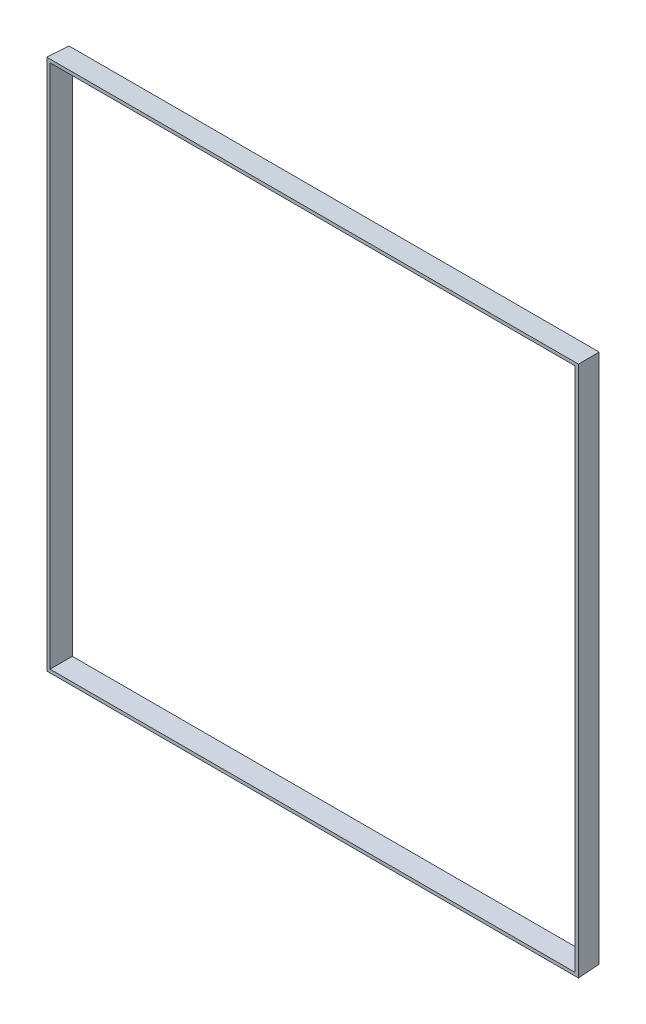
ISO-10303-21;
HEADER;
FILE_DESCRIPTION(('STEP AP214'),'2;1');
FILE_NAME('part.step','',(''),(''),'','','');
FILE_SCHEMA(('AUTOMOTIVE_DESIGN { 1 0 10303 214 1 1 1 1 }'));
ENDSEC;
DATA;
#1=APPLICATION_CONTEXT('core data for automotive mechanical design processes');
#2=APPLICATION_PROTOCOL_DEFINITION('international standard','automotive_design',2000,#1);
#3=PRODUCT_CONTEXT('',#1,'mechanical');
#4=PRODUCT('Part','Part','',(#3));
#5=PRODUCT_RELATED_PRODUCT_CATEGORY('part','',(#4));
#6=PRODUCT_DEFINITION_FORMATION('','',#4);
#7=PRODUCT_DEFINITION_CONTEXT('part definition',#1,'design');
#8=PRODUCT_DEFINITION('design','',#6,#7);
#9=PRODUCT_DEFINITION_SHAPE('','',#8);
#10=(LENGTH_UNIT() NAMED_UNIT(*) SI_UNIT(.MILLI.,.METRE.));
#11=(NAMED_UNIT(*) PLANE_ANGLE_UNIT() SI_UNIT($,.RADIAN.));
#12=(NAMED_UNIT(*) SI_UNIT($,.STERADIAN.) SOLID_ANGLE_UNIT());
#13=UNCERTAINTY_MEASURE_WITH_UNIT(LENGTH_MEASURE(1.E-05),#10,'distance_accuracy_value','');
#14=(GEOMETRIC_REPRESENTATION_CONTEXT(3) GLOBAL_UNCERTAINTY_ASSIGNED_CONTEXT((#13)) GLOBAL_UNIT_ASSIGNED_CONTEXT((#10,
#11,#12)) REPRESENTATION_CONTEXT('',''));
#15=CARTESIAN_POINT('',(0.,0.,0.));
#16=DIRECTION('',(0.,0.,1.));
#17=DIRECTION('',(1.,0.,0.));
#18=AXIS2_PLACEMENT_3D('',#15,#16,#17);
#19=CARTESIAN_POINT('',(0.,0.,0.));
#20=DIRECTION('',(0.,0.,-1.));
#21=DIRECTION('',(-1.,0.,0.));
#22=AXIS2_PLACEMENT_3D('',#19,#20,#21);
#23=PLANE('',#22);
#24=DIRECTION('',(0.,1.,0.));
#25=VECTOR('',#24,1.);
#26=CARTESIAN_POINT('',(123.3,-123.3,0.));
#27=LINE('',#26,#25);
#28=CARTESIAN_POINT('',(123.3,-123.3,0.));
#29=VERTEX_POINT('',#28);
#30=CARTESIAN_POINT('',(123.3,123.3,0.));
#31=VERTEX_POINT('',#30);
#32=EDGE_CURVE('E123',#29,#31,#27,.T.);
#33=ORIENTED_EDGE('',*,*,#32,.T.);
#34=DIRECTION('',(-1.,0.,0.));
#35=VECTOR('',#34,1.);
#36=CARTESIAN_POINT('',(-123.3,123.3,0.));
#37=LINE('',#36,#35);
#38=CARTESIAN_POINT('',(-123.3,123.3,0.));
#39=VERTEX_POINT('',#38);
#40=EDGE_CURVE('E163',#31,#39,#37,.T.);
#41=ORIENTED_EDGE('',*,*,#40,.T.);
#42=DIRECTION('',(0.,-1.,0.));
#43=VECTOR('',#42,1.);
#44=CARTESIAN_POINT('',(-123.3,-123.3,0.));
#45=LINE('',#44,#43);
#46=CARTESIAN_POINT('',(-123.3,-123.3,0.));
#47=VERTEX_POINT('',#46);
#48=EDGE_CURVE('E167',#39,#47,#45,.T.);
#49=ORIENTED_EDGE('',*,*,#48,.T.);
#50=DIRECTION('',(1.,0.,0.));
#51=VECTOR('',#50,1.);
#52=CARTESIAN_POINT('',(-123.3,-123.3,0.));
#53=LINE('',#52,#51);
#54=EDGE_CURVE('E171',#47,#29,#53,.T.);
#55=ORIENTED_EDGE('',*,*,#54,.T.);
#56=EDGE_LOOP('',(#33,#41,#49,#55));
#57=FACE_BOUND('',#56,.T.);
#58=DIRECTION('',(0.,1.,0.));
#59=VECTOR('',#58,1.);
#60=CARTESIAN_POINT('',(121.8,-121.8,0.));
#61=LINE('',#60,#59);
#62=CARTESIAN_POINT('',(121.8,-121.8,0.));
#63=VERTEX_POINT('',#62);
#64=CARTESIAN_POINT('',(121.8,121.8,0.));
#65=VERTEX_POINT('',#64);
#66=EDGE_CURVE('E115',#63,#65,#61,.T.);
#67=ORIENTED_EDGE('',*,*,#66,.F.);
#68=DIRECTION('',(1.,0.,0.));
#69=VECTOR('',#68,1.);
#70=CARTESIAN_POINT('',(-121.8,-121.8,0.));
#71=LINE('',#70,#69);
#72=CARTESIAN_POINT('',(-121.8,-121.8,0.));
#73=VERTEX_POINT('',#72);
#74=EDGE_CURVE('E127',#73,#63,#71,.T.);
#75=ORIENTED_EDGE('',*,*,#74,.F.);
#76=DIRECTION('',(0.,-1.,0.));
#77=VECTOR('',#76,1.);
#78=CARTESIAN_POINT('',(-121.8,-121.8,0.));
#79=LINE('',#78,#77);
#80=CARTESIAN_POINT('',(-121.8,121.8,0.));
#81=VERTEX_POINT('',#80);
#82=EDGE_CURVE('E68',#81,#73,#79,.T.);
#83=ORIENTED_EDGE('',*,*,#82,.F.);
#84=DIRECTION('',(-1.,0.,0.));
#85=VECTOR('',#84,1.);
#86=CARTESIAN_POINT('',(-121.8,121.8,0.));
#87=LINE('',#86,#85);
#88=EDGE_CURVE('E133',#65,#81,#87,.T.);
#89=ORIENTED_EDGE('',*,*,#88,.F.);
#90=EDGE_LOOP('',(#67,#75,#83,#89));
#91=FACE_BOUND('',#90,.T.);
#92=ADVANCED_FACE('F45',(#57,#91),#23,.F.);
#93=CARTESIAN_POINT('',(123.3,-123.3,0.));
#94=DIRECTION('',(0.999390827019096,0.,-0.034899496702501));
#95=DIRECTION('',(-0.034899496702501,0.,-0.999390827019096));
#96=AXIS2_PLACEMENT_3D('',#93,#94,#95);
#97=PLANE('',#96);
#98=ORIENTED_EDGE('',*,*,#32,.F.);
#99=DIRECTION('',(0.0348782627423747,-0.0348782627423747,0.998782765958718));
#100=VECTOR('',#99,1.);
#101=CARTESIAN_POINT('',(123.000012773939,-123.000012773939,-8.59051018712152));
#102=LINE('',#101,#100);
#103=CARTESIAN_POINT('',(122.950792305083,-122.950792305083,-10.));
#104=VERTEX_POINT('',#103);
#105=EDGE_CURVE('E11',#104,#29,#102,.T.);
#106=ORIENTED_EDGE('',*,*,#105,.F.);
#107=DIRECTION('',(0.,1.,0.));
#108=VECTOR('',#107,1.);
#109=CARTESIAN_POINT('',(122.950792305083,-123.3,-10.));
#110=LINE('',#109,#108);
#111=CARTESIAN_POINT('',(122.950792305083,122.950792305083,-10.));
#112=VERTEX_POINT('',#111);
#113=EDGE_CURVE('E174',#104,#112,#110,.T.);
#114=ORIENTED_EDGE('',*,*,#113,.T.);
#115=DIRECTION('',(0.0348782627423747,0.0348782627423747,0.998782765958718));
#116=VECTOR('',#115,1.);
#117=CARTESIAN_POINT('',(123.000012773939,123.000012773939,-8.59051018712152));
#118=LINE('',#117,#116);
#119=EDGE_CURVE('E176',#112,#31,#118,.T.);
#120=ORIENTED_EDGE('',*,*,#119,.T.);
#121=EDGE_LOOP('',(#98,#106,#114,#120));
#122=FACE_BOUND('',#121,.T.);
#123=ADVANCED_FACE('F208',(#122),#97,.T.);
#124=CARTESIAN_POINT('',(-123.3,-123.3,0.));
#125=DIRECTION('',(0.,-0.999390827019096,-0.034899496702501));
#126=DIRECTION('',(0.,0.034899496702501,-0.999390827019096));
#127=AXIS2_PLACEMENT_3D('',#124,#125,#126);
#128=PLANE('',#127);
#129=ORIENTED_EDGE('',*,*,#54,.F.);
#130=DIRECTION('',(-0.0348782627423747,-0.0348782627423747,0.998782765958718));
#131=VECTOR('',#130,1.);
#132=CARTESIAN_POINT('',(-123.3,-123.3,0.));
#133=LINE('',#132,#131);
#134=CARTESIAN_POINT('',(-122.950792305083,-122.950792305083,-10.));
#135=VERTEX_POINT('',#134);
#136=EDGE_CURVE('E55',#135,#47,#133,.T.);
#137=ORIENTED_EDGE('',*,*,#136,.F.);
#138=DIRECTION('',(1.,0.,0.));
#139=VECTOR('',#138,1.);
#140=CARTESIAN_POINT('',(-123.3,-122.950792305083,-10.));
#141=LINE('',#140,#139);
#142=EDGE_CURVE('E180',#135,#104,#141,.T.);
#143=ORIENTED_EDGE('',*,*,#142,.T.);
#144=ORIENTED_EDGE('',*,*,#105,.T.);
#145=EDGE_LOOP('',(#129,#137,#143,#144));
#146=FACE_BOUND('',#145,.T.);
#147=ADVANCED_FACE('F47',(#146),#128,.T.);
#148=CARTESIAN_POINT('',(-123.3,-123.3,0.));
#149=DIRECTION('',(-0.999390827019096,0.,-0.034899496702501));
#150=DIRECTION('',(-0.034899496702501,0.,0.999390827019096));
#151=AXIS2_PLACEMENT_3D('',#148,#149,#150);
#152=PLANE('',#151);
#153=ORIENTED_EDGE('',*,*,#48,.F.);
#154=DIRECTION('',(-0.0348782627423747,0.0348782627423747,0.998782765958718));
#155=VECTOR('',#154,1.);
#156=CARTESIAN_POINT('',(-123.3,123.3,0.));
#157=LINE('',#156,#155);
#158=CARTESIAN_POINT('',(-122.950792305083,122.950792305083,-10.));
#159=VERTEX_POINT('',#158);
#160=EDGE_CURVE('E179',#159,#39,#157,.T.);
#161=ORIENTED_EDGE('',*,*,#160,.F.);
#162=DIRECTION('',(0.,-1.,0.));
#163=VECTOR('',#162,1.);
#164=CARTESIAN_POINT('',(-122.950792305083,-123.3,-10.));
#165=LINE('',#164,#163);
#166=EDGE_CURVE('E190',#159,#135,#165,.T.);
#167=ORIENTED_EDGE('',*,*,#166,.T.);
#168=ORIENTED_EDGE('',*,*,#136,.T.);
#169=EDGE_LOOP('',(#153,#161,#167,#168));
#170=FACE_BOUND('',#169,.T.);
#171=ADVANCED_FACE('F211',(#170),#152,.T.);
#172=CARTESIAN_POINT('',(-123.3,123.3,0.));
#173=DIRECTION('',(0.,0.999390827019096,-0.034899496702501));
#174=DIRECTION('',(0.,0.034899496702501,0.999390827019096));
#175=AXIS2_PLACEMENT_3D('',#172,#173,#174);
#176=PLANE('',#175);
#177=ORIENTED_EDGE('',*,*,#40,.F.);
#178=ORIENTED_EDGE('',*,*,#119,.F.);
#179=DIRECTION('',(-1.,0.,0.));
#180=VECTOR('',#179,1.);
#181=CARTESIAN_POINT('',(-123.3,122.950792305083,-10.));
#182=LINE('',#181,#180);
#183=EDGE_CURVE('E49',#112,#159,#182,.T.);
#184=ORIENTED_EDGE('',*,*,#183,.T.);
#185=ORIENTED_EDGE('',*,*,#160,.T.);
#186=EDGE_LOOP('',(#177,#178,#184,#185));
#187=FACE_BOUND('',#186,.T.);
#188=ADVANCED_FACE('F201',(#187),#176,.T.);
#189=CARTESIAN_POINT('',(0.,0.,-10.));
#190=DIRECTION('',(0.,0.,-1.));
#191=DIRECTION('',(-1.,0.,0.));
#192=AXIS2_PLACEMENT_3D('',#189,#190,#191);
#193=PLANE('',#192);
#194=DIRECTION('',(0.,1.,0.));
#195=VECTOR('',#194,1.);
#196=CARTESIAN_POINT('',(121.450792305083,-121.8,-10.));
#197=LINE('',#196,#195);
#198=CARTESIAN_POINT('',(121.450792305083,-121.450792305083,-10.));
#199=VERTEX_POINT('',#198);
#200=CARTESIAN_POINT('',(121.450792305083,121.450792305083,-10.));
#201=VERTEX_POINT('',#200);
#202=EDGE_CURVE('E118',#199,#201,#197,.T.);
#203=ORIENTED_EDGE('',*,*,#202,.T.);
#204=DIRECTION('',(-1.,0.,0.));
#205=VECTOR('',#204,1.);
#206=CARTESIAN_POINT('',(-121.8,121.450792305083,-10.));
#207=LINE('',#206,#205);
#208=CARTESIAN_POINT('',(-121.450792305083,121.450792305083,-10.));
#209=VERTEX_POINT('',#208);
#210=EDGE_CURVE('E152',#201,#209,#207,.T.);
#211=ORIENTED_EDGE('',*,*,#210,.T.);
#212=DIRECTION('',(0.,-1.,0.));
#213=VECTOR('',#212,1.);
#214=CARTESIAN_POINT('',(-121.450792305083,-121.8,-10.));
#215=LINE('',#214,#213);
#216=CARTESIAN_POINT('',(-121.450792305083,-121.450792305083,-10.));
#217=VERTEX_POINT('',#216);
#218=EDGE_CURVE('E63',#209,#217,#215,.T.);
#219=ORIENTED_EDGE('',*,*,#218,.T.);
#220=DIRECTION('',(1.,0.,0.));
#221=VECTOR('',#220,1.);
#222=CARTESIAN_POINT('',(-121.8,-121.450792305083,-10.));
#223=LINE('',#222,#221);
#224=EDGE_CURVE('E145',#217,#199,#223,.T.);
#225=ORIENTED_EDGE('',*,*,#224,.T.);
#226=EDGE_LOOP('',(#203,#211,#219,#225));
#227=FACE_BOUND('',#226,.T.);
#228=ORIENTED_EDGE('',*,*,#113,.F.);
#229=ORIENTED_EDGE('',*,*,#142,.F.);
#230=ORIENTED_EDGE('',*,*,#166,.F.);
#231=ORIENTED_EDGE('',*,*,#183,.F.);
#232=EDGE_LOOP('',(#228,#229,#230,#231));
#233=FACE_BOUND('',#232,.T.);
#234=ADVANCED_FACE('F205',(#227,#233),#193,.T.);
#235=CARTESIAN_POINT('',(121.8,-121.8,0.));
#236=DIRECTION('',(0.999390827019096,0.,-0.034899496702501));
#237=DIRECTION('',(-0.0348994967025011,0.,-0.999390827019096));
#238=AXIS2_PLACEMENT_3D('',#235,#236,#237);
#239=PLANE('',#238);
#240=ORIENTED_EDGE('',*,*,#66,.T.);
#241=DIRECTION('',(0.0348782627423747,0.0348782627423747,0.998782765958718));
#242=VECTOR('',#241,1.);
#243=CARTESIAN_POINT('',(121.503662253575,121.503662253575,-8.48600276392053));
#244=LINE('',#243,#242);
#245=EDGE_CURVE('E141',#201,#65,#244,.T.);
#246=ORIENTED_EDGE('',*,*,#245,.F.);
#247=ORIENTED_EDGE('',*,*,#202,.F.);
#248=DIRECTION('',(0.0348782627423747,-0.0348782627423747,0.998782765958718));
#249=VECTOR('',#248,1.);
#250=CARTESIAN_POINT('',(121.503662253575,-121.503662253575,-8.48600276392053));
#251=LINE('',#250,#249);
#252=EDGE_CURVE('E111',#199,#63,#251,.T.);
#253=ORIENTED_EDGE('',*,*,#252,.T.);
#254=EDGE_LOOP('',(#240,#246,#247,#253));
#255=FACE_BOUND('',#254,.T.);
#256=ADVANCED_FACE('F113',(#255),#239,.F.);
#257=CARTESIAN_POINT('',(-121.8,-121.8,0.));
#258=DIRECTION('',(0.,-0.999390827019096,-0.034899496702501));
#259=DIRECTION('',(0.,0.0348994967025011,-0.999390827019096));
#260=AXIS2_PLACEMENT_3D('',#257,#258,#259);
#261=PLANE('',#260);
#262=ORIENTED_EDGE('',*,*,#74,.T.);
#263=ORIENTED_EDGE('',*,*,#252,.F.);
#264=ORIENTED_EDGE('',*,*,#224,.F.);
#265=DIRECTION('',(-0.0348782627423747,-0.0348782627423747,0.998782765958718));
#266=VECTOR('',#265,1.);
#267=CARTESIAN_POINT('',(-121.8,-121.8,0.));
#268=LINE('',#267,#266);
#269=EDGE_CURVE('E124',#217,#73,#268,.T.);
#270=ORIENTED_EDGE('',*,*,#269,.T.);
#271=EDGE_LOOP('',(#262,#263,#264,#270));
#272=FACE_BOUND('',#271,.T.);
#273=ADVANCED_FACE('F128',(#272),#261,.F.);
#274=CARTESIAN_POINT('',(-121.8,-121.8,0.));
#275=DIRECTION('',(-0.999390827019096,0.,-0.034899496702501));
#276=DIRECTION('',(-0.0348994967025011,0.,0.999390827019096));
#277=AXIS2_PLACEMENT_3D('',#274,#275,#276);
#278=PLANE('',#277);
#279=ORIENTED_EDGE('',*,*,#82,.T.);
#280=ORIENTED_EDGE('',*,*,#269,.F.);
#281=ORIENTED_EDGE('',*,*,#218,.F.);
#282=DIRECTION('',(-0.0348782627423747,0.0348782627423747,0.998782765958718));
#283=VECTOR('',#282,1.);
#284=CARTESIAN_POINT('',(-121.8,121.8,0.));
#285=LINE('',#284,#283);
#286=EDGE_CURVE('E144',#209,#81,#285,.T.);
#287=ORIENTED_EDGE('',*,*,#286,.T.);
#288=EDGE_LOOP('',(#279,#280,#281,#287));
#289=FACE_BOUND('',#288,.T.);
#290=ADVANCED_FACE('F271',(#289),#278,.F.);
#291=CARTESIAN_POINT('',(-121.8,121.8,0.));
#292=DIRECTION('',(0.,0.999390827019096,-0.034899496702501));
#293=DIRECTION('',(0.,0.0348994967025011,0.999390827019096));
#294=AXIS2_PLACEMENT_3D('',#291,#292,#293);
#295=PLANE('',#294);
#296=ORIENTED_EDGE('',*,*,#88,.T.);
#297=ORIENTED_EDGE('',*,*,#286,.F.);
#298=ORIENTED_EDGE('',*,*,#210,.F.);
#299=ORIENTED_EDGE('',*,*,#245,.T.);
#300=EDGE_LOOP('',(#296,#297,#298,#299));
#301=FACE_BOUND('',#300,.T.);
#302=ADVANCED_FACE('F278',(#301),#295,.F.);
#303=CLOSED_SHELL('',(#92,#123,#147,#171,#188,#234,#256,#273,#290,#302));
#304=MANIFOLD_SOLID_BREP('B2',#303);
#305=ADVANCED_BREP_SHAPE_REPRESENTATION('',(#18,#304),#14);
#306=SHAPE_DEFINITION_REPRESENTATION(#9,#305);
ENDSEC;
END-ISO-10303-21;
